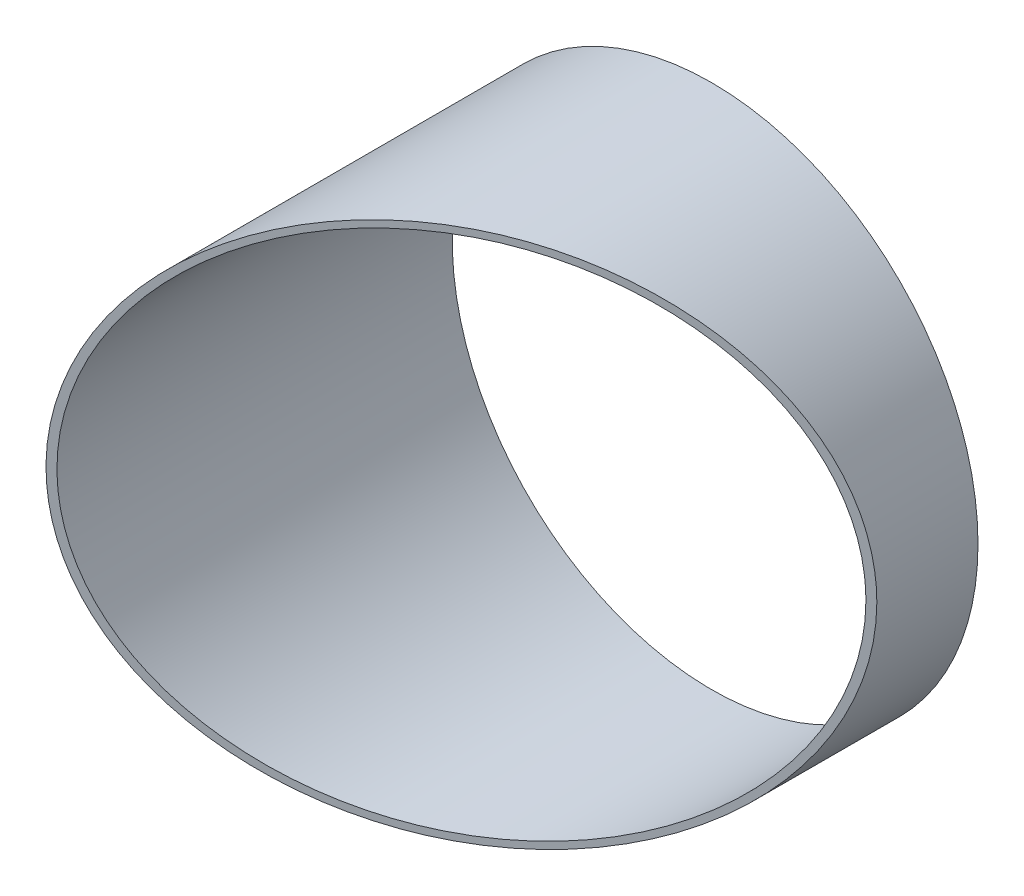
ISO-10303-21;
HEADER;
FILE_DESCRIPTION(('STEP AP214'),'2;1');
FILE_NAME('part.step','',(''),(''),'','','');
FILE_SCHEMA(('AUTOMOTIVE_DESIGN { 1 0 10303 214 1 1 1 1 }'));
ENDSEC;
DATA;
#1=APPLICATION_CONTEXT('core data for automotive mechanical design processes');
#2=APPLICATION_PROTOCOL_DEFINITION('international standard','automotive_design',2000,#1);
#3=PRODUCT_CONTEXT('',#1,'mechanical');
#4=PRODUCT('Part','Part','',(#3));
#5=PRODUCT_RELATED_PRODUCT_CATEGORY('part','',(#4));
#6=PRODUCT_DEFINITION_FORMATION('','',#4);
#7=PRODUCT_DEFINITION_CONTEXT('part definition',#1,'design');
#8=PRODUCT_DEFINITION('design','',#6,#7);
#9=PRODUCT_DEFINITION_SHAPE('','',#8);
#10=(LENGTH_UNIT() NAMED_UNIT(*) SI_UNIT(.MILLI.,.METRE.));
#11=(NAMED_UNIT(*) PLANE_ANGLE_UNIT() SI_UNIT($,.RADIAN.));
#12=(NAMED_UNIT(*) SI_UNIT($,.STERADIAN.) SOLID_ANGLE_UNIT());
#13=UNCERTAINTY_MEASURE_WITH_UNIT(LENGTH_MEASURE(1.E-05),#10,'distance_accuracy_value','');
#14=(GEOMETRIC_REPRESENTATION_CONTEXT(3) GLOBAL_UNCERTAINTY_ASSIGNED_CONTEXT((#13)) GLOBAL_UNIT_ASSIGNED_CONTEXT((#10,
#11,#12)) REPRESENTATION_CONTEXT('',''));
#15=CARTESIAN_POINT('',(0.,0.,0.));
#16=DIRECTION('',(0.,0.,1.));
#17=DIRECTION('',(1.,0.,0.));
#18=AXIS2_PLACEMENT_3D('',#15,#16,#17);
#19=CARTESIAN_POINT('',(0.,0.,100.));
#20=DIRECTION('',(0.,0.,-1.));
#21=DIRECTION('',(-1.,0.,0.));
#22=AXIS2_PLACEMENT_3D('',#19,#20,#21);
#23=CYLINDRICAL_SURFACE('',#22,38.);
#24=CARTESIAN_POINT('',(0.,0.,0.));
#25=DIRECTION('',(0.,0.,1.));
#26=DIRECTION('',(1.,0.,0.));
#27=AXIS2_PLACEMENT_3D('',#24,#25,#26);
#28=CIRCLE('',#27,38.);
#29=CARTESIAN_POINT('',(38.,0.,0.));
#30=VERTEX_POINT('',#29);
#31=EDGE_CURVE('E10',#30,#30,#28,.T.);
#32=ORIENTED_EDGE('',*,*,#31,.T.);
#33=EDGE_LOOP('',(#32));
#34=FACE_BOUND('',#33,.T.);
#35=CARTESIAN_POINT('',(0.,0.,35.6916394166265));
#36=DIRECTION('',(-0.488274625508617,0.,-0.872690030929894));
#37=DIRECTION('',(0.872690030929894,0.,-0.488274625508617));
#38=AXIS2_PLACEMENT_3D('',#35,#36,#37);
#39=ELLIPSE('',#38,43.5435247948337,38.);
#40=CARTESIAN_POINT('',(38.,0.,14.4304411541039));
#41=VERTEX_POINT('',#40);
#42=EDGE_CURVE('E42',#41,#41,#39,.T.);
#43=ORIENTED_EDGE('',*,*,#42,.T.);
#44=EDGE_LOOP('',(#43));
#45=FACE_BOUND('',#44,.T.);
#46=ADVANCED_FACE('F31',(#34,#45),#23,.T.);
#47=CARTESIAN_POINT('',(0.,0.,0.));
#48=DIRECTION('',(0.,0.,1.));
#49=DIRECTION('',(1.,0.,0.));
#50=AXIS2_PLACEMENT_3D('',#47,#48,#49);
#51=PLANE('',#50);
#52=ORIENTED_EDGE('',*,*,#31,.F.);
#53=EDGE_LOOP('',(#52));
#54=FACE_BOUND('',#53,.T.);
#55=CARTESIAN_POINT('',(0.,0.,0.));
#56=DIRECTION('',(0.,0.,1.));
#57=DIRECTION('',(1.,0.,0.));
#58=AXIS2_PLACEMENT_3D('',#55,#56,#57);
#59=CIRCLE('',#58,37.);
#60=CARTESIAN_POINT('',(37.,0.,0.));
#61=VERTEX_POINT('',#60);
#62=EDGE_CURVE('E38',#61,#61,#59,.T.);
#63=ORIENTED_EDGE('',*,*,#62,.T.);
#64=EDGE_LOOP('',(#63));
#65=FACE_BOUND('',#64,.T.);
#66=ADVANCED_FACE('F57',(#54,#65),#51,.F.);
#67=CARTESIAN_POINT('',(0.,0.,100.));
#68=DIRECTION('',(0.,0.,-1.));
#69=DIRECTION('',(-1.,0.,0.));
#70=AXIS2_PLACEMENT_3D('',#67,#68,#69);
#71=CYLINDRICAL_SURFACE('',#70,37.);
#72=CARTESIAN_POINT('',(0.,0.,35.6916394166265));
#73=DIRECTION('',(-0.488274625508617,0.,-0.872690030929894));
#74=DIRECTION('',(0.872690030929894,0.,-0.488274625508617));
#75=AXIS2_PLACEMENT_3D('',#72,#73,#74);
#76=ELLIPSE('',#75,42.3976425633907,37.);
#77=CARTESIAN_POINT('',(37.,0.,14.9899463715387));
#78=VERTEX_POINT('',#77);
#79=EDGE_CURVE('E34',#78,#78,#76,.T.);
#80=ORIENTED_EDGE('',*,*,#79,.F.);
#81=EDGE_LOOP('',(#80));
#82=FACE_BOUND('',#81,.T.);
#83=ORIENTED_EDGE('',*,*,#62,.F.);
#84=EDGE_LOOP('',(#83));
#85=FACE_BOUND('',#84,.T.);
#86=ADVANCED_FACE('F54',(#82,#85),#71,.F.);
#87=CARTESIAN_POINT('',(38.,-38.,14.4304411541039));
#88=DIRECTION('',(-0.488274625508617,0.,-0.872690030929894));
#89=DIRECTION('',(-0.872690030929894,0.,0.488274625508617));
#90=AXIS2_PLACEMENT_3D('',#87,#88,#89);
#91=PLANE('',#90);
#92=ORIENTED_EDGE('',*,*,#79,.T.);
#93=EDGE_LOOP('',(#92));
#94=FACE_BOUND('',#93,.T.);
#95=ORIENTED_EDGE('',*,*,#42,.F.);
#96=EDGE_LOOP('',(#95));
#97=FACE_BOUND('',#96,.T.);
#98=ADVANCED_FACE('F51',(#94,#97),#91,.F.);
#99=CLOSED_SHELL('',(#46,#66,#86,#98));
#100=MANIFOLD_SOLID_BREP('B2',#99);
#101=ADVANCED_BREP_SHAPE_REPRESENTATION('',(#18,#100),#14);
#102=SHAPE_DEFINITION_REPRESENTATION(#9,#101);
ENDSEC;
END-ISO-10303-21;
